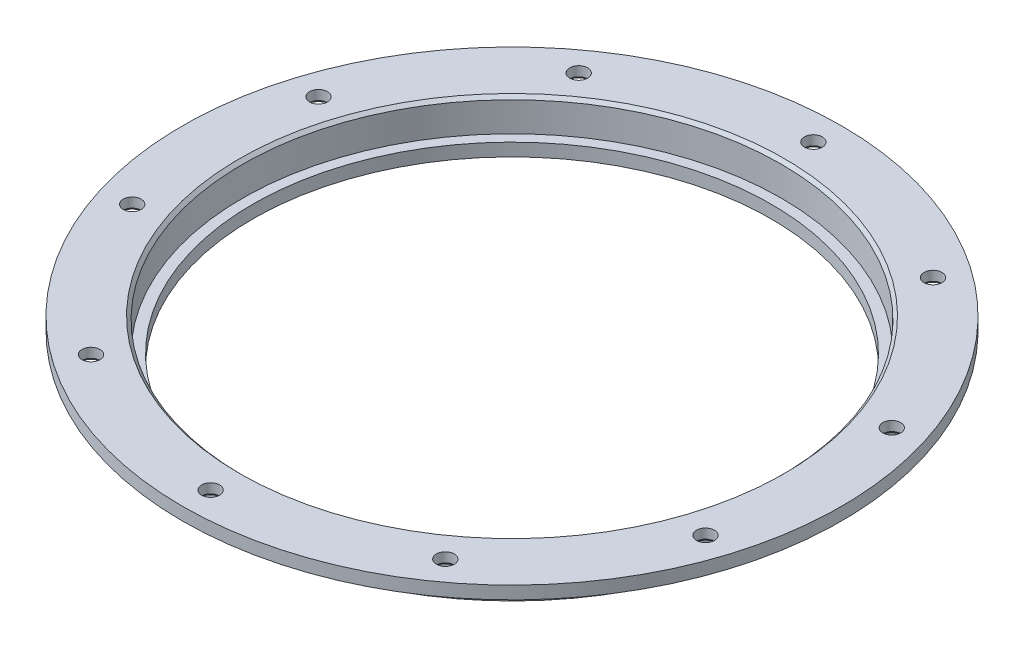
ISO-10303-21;
HEADER;
FILE_DESCRIPTION(('STEP AP214'),'2;1');
FILE_NAME('part.step','',(''),(''),'','','');
FILE_SCHEMA(('AUTOMOTIVE_DESIGN { 1 0 10303 214 1 1 1 1 }'));
ENDSEC;
DATA;
#1=APPLICATION_CONTEXT('core data for automotive mechanical design processes');
#2=APPLICATION_PROTOCOL_DEFINITION('international standard','automotive_design',2000,#1);
#3=PRODUCT_CONTEXT('',#1,'mechanical');
#4=PRODUCT('Part','Part','',(#3));
#5=PRODUCT_RELATED_PRODUCT_CATEGORY('part','',(#4));
#6=PRODUCT_DEFINITION_FORMATION('','',#4);
#7=PRODUCT_DEFINITION_CONTEXT('part definition',#1,'design');
#8=PRODUCT_DEFINITION('design','',#6,#7);
#9=PRODUCT_DEFINITION_SHAPE('','',#8);
#10=(LENGTH_UNIT() NAMED_UNIT(*) SI_UNIT(.MILLI.,.METRE.));
#11=(NAMED_UNIT(*) PLANE_ANGLE_UNIT() SI_UNIT($,.RADIAN.));
#12=(NAMED_UNIT(*) SI_UNIT($,.STERADIAN.) SOLID_ANGLE_UNIT());
#13=UNCERTAINTY_MEASURE_WITH_UNIT(LENGTH_MEASURE(1.E-05),#10,'distance_accuracy_value','');
#14=(GEOMETRIC_REPRESENTATION_CONTEXT(3) GLOBAL_UNCERTAINTY_ASSIGNED_CONTEXT((#13)) GLOBAL_UNIT_ASSIGNED_CONTEXT((#10,
#11,#12)) REPRESENTATION_CONTEXT('',''));
#15=CARTESIAN_POINT('',(0.,0.,0.));
#16=DIRECTION('',(0.,0.,1.));
#17=DIRECTION('',(1.,0.,0.));
#18=AXIS2_PLACEMENT_3D('',#15,#16,#17);
#19=CARTESIAN_POINT('',(0.,2.,0.));
#20=DIRECTION('',(0.,1.,0.));
#21=DIRECTION('',(0.,0.,1.));
#22=AXIS2_PLACEMENT_3D('',#19,#20,#21);
#23=PLANE('',#22);
#24=CARTESIAN_POINT('',(0.,2.,0.));
#25=DIRECTION('',(0.,1.,0.));
#26=DIRECTION('',(0.,0.,1.));
#27=AXIS2_PLACEMENT_3D('',#24,#25,#26);
#28=CIRCLE('',#27,40.5);
#29=CARTESIAN_POINT('',(0.,2.,40.5));
#30=VERTEX_POINT('',#29);
#31=EDGE_CURVE('E153',#30,#30,#28,.T.);
#32=ORIENTED_EDGE('',*,*,#31,.F.);
#33=EDGE_LOOP('',(#32));
#34=FACE_BOUND('',#33,.T.);
#35=CARTESIAN_POINT('',(0.,2.,0.));
#36=DIRECTION('',(0.,1.,0.));
#37=DIRECTION('',(0.,0.,1.));
#38=AXIS2_PLACEMENT_3D('',#35,#36,#37);
#39=CIRCLE('',#38,42.1);
#40=CARTESIAN_POINT('',(0.,2.,-42.1));
#41=VERTEX_POINT('',#40);
#42=EDGE_CURVE('E158',#41,#41,#39,.T.);
#43=ORIENTED_EDGE('',*,*,#42,.T.);
#44=EDGE_LOOP('',(#43));
#45=FACE_BOUND('',#44,.T.);
#46=ADVANCED_FACE('F44',(#34,#45),#23,.T.);
#47=CARTESIAN_POINT('',(0.,0.,0.));
#48=DIRECTION('',(0.,1.,0.));
#49=DIRECTION('',(0.,0.,1.));
#50=AXIS2_PLACEMENT_3D('',#47,#48,#49);
#51=PLANE('',#50);
#52=CARTESIAN_POINT('',(0.,0.,0.));
#53=DIRECTION('',(0.,1.,0.));
#54=DIRECTION('',(0.,0.,1.));
#55=AXIS2_PLACEMENT_3D('',#52,#53,#54);
#56=CIRCLE('',#55,44.5);
#57=CARTESIAN_POINT('',(0.,0.,44.5));
#58=VERTEX_POINT('',#57);
#59=EDGE_CURVE('E149',#58,#58,#56,.T.);
#60=ORIENTED_EDGE('',*,*,#59,.F.);
#61=EDGE_LOOP('',(#60));
#62=FACE_BOUND('',#61,.T.);
#63=CARTESIAN_POINT('',(0.,0.,0.));
#64=DIRECTION('',(0.,1.,0.));
#65=DIRECTION('',(0.,0.,1.));
#66=AXIS2_PLACEMENT_3D('',#63,#64,#65);
#67=CIRCLE('',#66,40.5);
#68=CARTESIAN_POINT('',(0.,0.,40.5));
#69=VERTEX_POINT('',#68);
#70=EDGE_CURVE('E154',#69,#69,#67,.T.);
#71=ORIENTED_EDGE('',*,*,#70,.T.);
#72=EDGE_LOOP('',(#71));
#73=FACE_BOUND('',#72,.T.);
#74=ADVANCED_FACE('F257',(#62,#73),#51,.F.);
#75=CARTESIAN_POINT('',(0.,2.,0.));
#76=DIRECTION('',(0.,-1.,0.));
#77=DIRECTION('',(0.,0.,-1.));
#78=AXIS2_PLACEMENT_3D('',#75,#76,#77);
#79=CYLINDRICAL_SURFACE('',#78,44.5);
#80=CARTESIAN_POINT('',(0.,4.59999999999999,0.));
#81=DIRECTION('',(0.,1.,0.));
#82=DIRECTION('',(0.,0.,1.));
#83=AXIS2_PLACEMENT_3D('',#80,#81,#82);
#84=CIRCLE('',#83,44.5);
#85=CARTESIAN_POINT('',(0.,4.59999999999999,44.5));
#86=VERTEX_POINT('',#85);
#87=EDGE_CURVE('E58',#86,#86,#84,.F.);
#88=ORIENTED_EDGE('',*,*,#87,.T.);
#89=EDGE_LOOP('',(#88));
#90=FACE_BOUND('',#89,.T.);
#91=ORIENTED_EDGE('',*,*,#59,.T.);
#92=EDGE_LOOP('',(#91));
#93=FACE_BOUND('',#92,.T.);
#94=ADVANCED_FACE('F264',(#90,#93),#79,.T.);
#95=CARTESIAN_POINT('',(0.,2.,0.));
#96=DIRECTION('',(0.,-1.,0.));
#97=DIRECTION('',(0.,0.,-1.));
#98=AXIS2_PLACEMENT_3D('',#95,#96,#97);
#99=CYLINDRICAL_SURFACE('',#98,40.5);
#100=ORIENTED_EDGE('',*,*,#31,.T.);
#101=EDGE_LOOP('',(#100));
#102=FACE_BOUND('',#101,.T.);
#103=ORIENTED_EDGE('',*,*,#70,.F.);
#104=EDGE_LOOP('',(#103));
#105=FACE_BOUND('',#104,.T.);
#106=ADVANCED_FACE('F270',(#102,#105),#99,.F.);
#107=CARTESIAN_POINT('',(0.,5.1,0.));
#108=DIRECTION('',(0.,-1.,0.));
#109=DIRECTION('',(0.,0.,-1.));
#110=AXIS2_PLACEMENT_3D('',#107,#108,#109);
#111=CYLINDRICAL_SURFACE('',#110,42.1);
#112=CARTESIAN_POINT('',(0.,6.59999999999996,0.));
#113=DIRECTION('',(0.,1.,0.));
#114=DIRECTION('',(0.,0.,1.));
#115=AXIS2_PLACEMENT_3D('',#112,#113,#114);
#116=CIRCLE('',#115,42.1);
#117=CARTESIAN_POINT('',(0.,6.59999999999996,-42.1));
#118=VERTEX_POINT('',#117);
#119=EDGE_CURVE('E53',#118,#118,#116,.T.);
#120=CARTESIAN_POINT('',(0.,6.59999999999996,-42.1));
#121=CARTESIAN_POINT('',(0.,6.55208333333329,-42.1));
#122=CARTESIAN_POINT('',(0.,6.50416666666663,-42.1));
#123=CARTESIAN_POINT('',(0.,6.40833333333329,-42.1));
#124=CARTESIAN_POINT('',(0.,6.36041666666663,-42.1));
#125=CARTESIAN_POINT('',(0.,6.26458333333329,-42.1));
#126=CARTESIAN_POINT('',(0.,6.21666666666663,-42.1));
#127=CARTESIAN_POINT('',(0.,6.1208333333333,-42.1));
#128=CARTESIAN_POINT('',(0.,6.07291666666663,-42.1));
#129=CARTESIAN_POINT('',(0.,5.9770833333333,-42.1));
#130=CARTESIAN_POINT('',(0.,5.92916666666663,-42.1));
#131=CARTESIAN_POINT('',(0.,5.8333333333333,-42.1));
#132=CARTESIAN_POINT('',(0.,5.78541666666663,-42.1));
#133=CARTESIAN_POINT('',(0.,5.6895833333333,-42.1));
#134=CARTESIAN_POINT('',(0.,5.64166666666663,-42.1));
#135=CARTESIAN_POINT('',(0.,5.5458333333333,-42.1));
#136=CARTESIAN_POINT('',(0.,5.49791666666663,-42.1));
#137=CARTESIAN_POINT('',(0.,5.4020833333333,-42.1));
#138=CARTESIAN_POINT('',(0.,5.35416666666664,-42.1));
#139=CARTESIAN_POINT('',(0.,5.2583333333333,-42.1));
#140=CARTESIAN_POINT('',(0.,5.21041666666664,-42.1));
#141=CARTESIAN_POINT('',(0.,5.1145833333333,-42.1));
#142=CARTESIAN_POINT('',(0.,5.06666666666664,-42.1));
#143=CARTESIAN_POINT('',(0.,4.97083333333331,-42.1));
#144=CARTESIAN_POINT('',(0.,4.92291666666664,-42.1));
#145=CARTESIAN_POINT('',(0.,4.82708333333331,-42.1));
#146=CARTESIAN_POINT('',(0.,4.77916666666664,-42.1));
#147=CARTESIAN_POINT('',(0.,4.68333333333331,-42.1));
#148=CARTESIAN_POINT('',(0.,4.63541666666664,-42.1));
#149=CARTESIAN_POINT('',(0.,4.53958333333331,-42.1));
#150=CARTESIAN_POINT('',(0.,4.49166666666664,-42.1));
#151=CARTESIAN_POINT('',(0.,4.39583333333331,-42.1));
#152=CARTESIAN_POINT('',(0.,4.34791666666665,-42.1));
#153=CARTESIAN_POINT('',(0.,4.25208333333331,-42.1));
#154=CARTESIAN_POINT('',(0.,4.20416666666665,-42.1));
#155=CARTESIAN_POINT('',(0.,4.10833333333331,-42.1));
#156=CARTESIAN_POINT('',(0.,4.06041666666665,-42.1));
#157=CARTESIAN_POINT('',(0.,3.96458333333332,-42.1));
#158=CARTESIAN_POINT('',(0.,3.91666666666665,-42.1));
#159=CARTESIAN_POINT('',(0.,3.82083333333332,-42.1));
#160=CARTESIAN_POINT('',(0.,3.77291666666665,-42.1));
#161=CARTESIAN_POINT('',(0.,3.67708333333332,-42.1));
#162=CARTESIAN_POINT('',(0.,3.62916666666665,-42.1));
#163=CARTESIAN_POINT('',(0.,3.53333333333332,-42.1));
#164=CARTESIAN_POINT('',(0.,3.48541666666665,-42.1));
#165=CARTESIAN_POINT('',(0.,3.38958333333332,-42.1));
#166=CARTESIAN_POINT('',(0.,3.34166666666665,-42.1));
#167=CARTESIAN_POINT('',(0.,3.24583333333332,-42.1));
#168=CARTESIAN_POINT('',(0.,3.19791666666666,-42.1));
#169=CARTESIAN_POINT('',(0.,3.10208333333332,-42.1));
#170=CARTESIAN_POINT('',(0.,3.05416666666666,-42.1));
#171=CARTESIAN_POINT('',(0.,2.95833333333332,-42.1));
#172=CARTESIAN_POINT('',(0.,2.91041666666666,-42.1));
#173=CARTESIAN_POINT('',(0.,2.81458333333333,-42.1));
#174=CARTESIAN_POINT('',(0.,2.76666666666666,-42.1));
#175=CARTESIAN_POINT('',(0.,2.67083333333333,-42.1));
#176=CARTESIAN_POINT('',(0.,2.62291666666666,-42.1));
#177=CARTESIAN_POINT('',(0.,2.52708333333333,-42.1));
#178=CARTESIAN_POINT('',(0.,2.47916666666666,-42.1));
#179=CARTESIAN_POINT('',(0.,2.38333333333333,-42.1));
#180=CARTESIAN_POINT('',(0.,2.33541666666666,-42.1));
#181=CARTESIAN_POINT('',(0.,2.23958333333333,-42.1));
#182=CARTESIAN_POINT('',(0.,2.19166666666667,-42.1));
#183=CARTESIAN_POINT('',(0.,2.09583333333333,-42.1));
#184=CARTESIAN_POINT('',(0.,2.04791666666667,-42.1));
#185=CARTESIAN_POINT('',(0.,2.,-42.1));
#186=B_SPLINE_CURVE_WITH_KNOTS('',3,(#120,#121,#122,#123,#124,#125,#126,#127,#128,#129,#130,
#131,#132,#133,#134,#135,#136,#137,#138,#139,#140,#141,#142,#143,#144,#145,#146,#147,#148,#149,
#150,#151,#152,#153,#154,#155,#156,#157,#158,#159,#160,#161,#162,#163,#164,#165,#166,#167,#168,
#169,#170,#171,#172,#173,#174,#175,#176,#177,#178,#179,#180,#181,#182,#183,#184,#185),
.UNSPECIFIED.,.F.,.F.,(4,2,2,2,2,2,2,2,2,2,2,2,2,2,2,2,2,2,2,2,2,2,2,2,2,2,2,2,2,2,2,2,4),(0.,
0.143749999999999,0.287499999999997,0.431249999999996,0.574999999999995,0.718749999999993,
0.862499999999992,1.00624999999999,1.14999999999999,1.29374999999999,1.43749999999999,
1.58124999999999,1.72499999999998,1.86874999999998,2.01249999999998,2.15624999999998,
2.29999999999998,2.44374999999998,2.58749999999998,2.73124999999997,2.87499999999997,
3.01874999999997,3.16249999999997,3.30624999999997,3.44999999999997,3.59374999999997,
3.73749999999997,3.88124999999996,4.02499999999996,4.16874999999996,4.31249999999996,
4.45624999999996,4.59999999999996),.UNSPECIFIED.);
#187=EDGE_CURVE('BSEAM220',#118,#41,#186,.T.);
#188=ORIENTED_EDGE('',*,*,#119,.T.);
#189=ORIENTED_EDGE('',*,*,#42,.F.);
#190=ORIENTED_EDGE('',*,*,#187,.T.);
#191=ORIENTED_EDGE('',*,*,#187,.F.);
#192=EDGE_LOOP('',(#188,#190,#189,#191));
#193=FACE_BOUND('',#192,.T.);
#194=ADVANCED_FACE('F220',(#193),#111,.F.);
#195=CARTESIAN_POINT('',(0.,7.1,0.));
#196=DIRECTION('',(0.,1.,0.));
#197=DIRECTION('',(0.,0.,1.));
#198=AXIS2_PLACEMENT_3D('',#195,#196,#197);
#199=PLANE('',#198);
#200=CARTESIAN_POINT('',(0.,7.1,0.));
#201=DIRECTION('',(0.,1.,0.));
#202=DIRECTION('',(0.,0.,1.));
#203=AXIS2_PLACEMENT_3D('',#200,#201,#202);
#204=CIRCLE('',#203,42.6);
#205=CARTESIAN_POINT('',(0.,7.1,42.6));
#206=VERTEX_POINT('',#205);
#207=EDGE_CURVE('E10',#206,#206,#204,.F.);
#208=ORIENTED_EDGE('',*,*,#207,.T.);
#209=EDGE_LOOP('',(#208));
#210=FACE_BOUND('',#209,.T.);
#211=CARTESIAN_POINT('',(0.,7.1,-47.1));
#212=DIRECTION('',(0.,1.,0.));
#213=DIRECTION('',(0.,0.,1.));
#214=AXIS2_PLACEMENT_3D('',#211,#212,#213);
#215=CIRCLE('',#214,1.4);
#216=CARTESIAN_POINT('',(0.,7.1,-45.7));
#217=VERTEX_POINT('',#216);
#218=EDGE_CURVE('E170',#217,#217,#215,.T.);
#219=ORIENTED_EDGE('',*,*,#218,.F.);
#220=EDGE_LOOP('',(#219));
#221=FACE_BOUND('',#220,.T.);
#222=CARTESIAN_POINT('',(-27.6846853829755,7.1,-38.10470043506));
#223=DIRECTION('',(0.,1.,0.));
#224=DIRECTION('',(0.,0.,1.));
#225=AXIS2_PLACEMENT_3D('',#222,#223,#224);
#226=CIRCLE('',#225,1.4);
#227=CARTESIAN_POINT('',(-27.6846853829755,7.1,-36.70470043506));
#228=VERTEX_POINT('',#227);
#229=EDGE_CURVE('E179',#228,#228,#226,.T.);
#230=ORIENTED_EDGE('',*,*,#229,.F.);
#231=EDGE_LOOP('',(#230));
#232=FACE_BOUND('',#231,.T.);
#233=CARTESIAN_POINT('',(-44.7947619175017,7.1,-14.55470043506));
#234=DIRECTION('',(0.,1.,0.));
#235=DIRECTION('',(0.,0.,1.));
#236=AXIS2_PLACEMENT_3D('',#233,#234,#235);
#237=CIRCLE('',#236,1.4);
#238=CARTESIAN_POINT('',(-44.7947619175017,7.1,-13.15470043506));
#239=VERTEX_POINT('',#238);
#240=EDGE_CURVE('E174',#239,#239,#237,.T.);
#241=ORIENTED_EDGE('',*,*,#240,.F.);
#242=EDGE_LOOP('',(#241));
#243=FACE_BOUND('',#242,.T.);
#244=CARTESIAN_POINT('',(-44.7947619175017,7.1,14.55470043506));
#245=DIRECTION('',(0.,1.,0.));
#246=DIRECTION('',(0.,0.,1.));
#247=AXIS2_PLACEMENT_3D('',#244,#245,#246);
#248=CIRCLE('',#247,1.4);
#249=CARTESIAN_POINT('',(-44.7947619175017,7.1,15.95470043506));
#250=VERTEX_POINT('',#249);
#251=EDGE_CURVE('E178',#250,#250,#248,.T.);
#252=ORIENTED_EDGE('',*,*,#251,.F.);
#253=EDGE_LOOP('',(#252));
#254=FACE_BOUND('',#253,.T.);
#255=CARTESIAN_POINT('',(-27.6846853829755,7.1,38.10470043506));
#256=DIRECTION('',(0.,1.,0.));
#257=DIRECTION('',(0.,0.,1.));
#258=AXIS2_PLACEMENT_3D('',#255,#256,#257);
#259=CIRCLE('',#258,1.4);
#260=CARTESIAN_POINT('',(-27.6846853829755,7.1,39.50470043506));
#261=VERTEX_POINT('',#260);
#262=EDGE_CURVE('E183',#261,#261,#259,.T.);
#263=ORIENTED_EDGE('',*,*,#262,.F.);
#264=EDGE_LOOP('',(#263));
#265=FACE_BOUND('',#264,.T.);
#266=CARTESIAN_POINT('',(0.,7.1,47.1));
#267=DIRECTION('',(0.,1.,0.));
#268=DIRECTION('',(0.,0.,1.));
#269=AXIS2_PLACEMENT_3D('',#266,#267,#268);
#270=CIRCLE('',#269,1.4);
#271=CARTESIAN_POINT('',(0.,7.1,48.5));
#272=VERTEX_POINT('',#271);
#273=EDGE_CURVE('E187',#272,#272,#270,.T.);
#274=ORIENTED_EDGE('',*,*,#273,.F.);
#275=EDGE_LOOP('',(#274));
#276=FACE_BOUND('',#275,.T.);
#277=CARTESIAN_POINT('',(27.6846853829755,7.1,38.10470043506));
#278=DIRECTION('',(0.,1.,0.));
#279=DIRECTION('',(0.,0.,1.));
#280=AXIS2_PLACEMENT_3D('',#277,#278,#279);
#281=CIRCLE('',#280,1.4);
#282=CARTESIAN_POINT('',(27.6846853829755,7.1,39.50470043506));
#283=VERTEX_POINT('',#282);
#284=EDGE_CURVE('E191',#283,#283,#281,.T.);
#285=ORIENTED_EDGE('',*,*,#284,.F.);
#286=EDGE_LOOP('',(#285));
#287=FACE_BOUND('',#286,.T.);
#288=CARTESIAN_POINT('',(44.7947619175017,7.1,14.55470043506));
#289=DIRECTION('',(0.,1.,0.));
#290=DIRECTION('',(0.,0.,1.));
#291=AXIS2_PLACEMENT_3D('',#288,#289,#290);
#292=CIRCLE('',#291,1.4);
#293=CARTESIAN_POINT('',(44.7947619175017,7.1,15.95470043506));
#294=VERTEX_POINT('',#293);
#295=EDGE_CURVE('E195',#294,#294,#292,.T.);
#296=ORIENTED_EDGE('',*,*,#295,.F.);
#297=EDGE_LOOP('',(#296));
#298=FACE_BOUND('',#297,.T.);
#299=CARTESIAN_POINT('',(44.7947619175017,7.1,-14.55470043506));
#300=DIRECTION('',(0.,1.,0.));
#301=DIRECTION('',(0.,0.,1.));
#302=AXIS2_PLACEMENT_3D('',#299,#300,#301);
#303=CIRCLE('',#302,1.4);
#304=CARTESIAN_POINT('',(44.7947619175017,7.1,-13.15470043506));
#305=VERTEX_POINT('',#304);
#306=EDGE_CURVE('E199',#305,#305,#303,.T.);
#307=ORIENTED_EDGE('',*,*,#306,.F.);
#308=EDGE_LOOP('',(#307));
#309=FACE_BOUND('',#308,.T.);
#310=CARTESIAN_POINT('',(27.6846853829755,7.1,-38.10470043506));
#311=DIRECTION('',(0.,1.,0.));
#312=DIRECTION('',(0.,0.,1.));
#313=AXIS2_PLACEMENT_3D('',#310,#311,#312);
#314=CIRCLE('',#313,1.4);
#315=CARTESIAN_POINT('',(27.6846853829755,7.1,-36.70470043506));
#316=VERTEX_POINT('',#315);
#317=EDGE_CURVE('E203',#316,#316,#314,.T.);
#318=ORIENTED_EDGE('',*,*,#317,.F.);
#319=EDGE_LOOP('',(#318));
#320=FACE_BOUND('',#319,.T.);
#321=CARTESIAN_POINT('',(0.,7.1,0.));
#322=DIRECTION('',(0.,1.,0.));
#323=DIRECTION('',(0.,0.,1.));
#324=AXIS2_PLACEMENT_3D('',#321,#322,#323);
#325=CIRCLE('',#324,51.5);
#326=CARTESIAN_POINT('',(0.,7.1,51.5));
#327=VERTEX_POINT('',#326);
#328=EDGE_CURVE('E165',#327,#327,#325,.T.);
#329=ORIENTED_EDGE('',*,*,#328,.T.);
#330=EDGE_LOOP('',(#329));
#331=FACE_BOUND('',#330,.T.);
#332=ADVANCED_FACE('F216',(#210,#221,#232,#243,#254,#265,#276,#287,#298,#309,#320,#331),#199,.T.);
#333=CARTESIAN_POINT('',(0.,5.1,0.));
#334=DIRECTION('',(0.,1.,0.));
#335=DIRECTION('',(0.,0.,1.));
#336=AXIS2_PLACEMENT_3D('',#333,#334,#335);
#337=PLANE('',#336);
#338=CARTESIAN_POINT('',(0.,5.1,0.));
#339=DIRECTION('',(0.,1.,0.));
#340=DIRECTION('',(0.,0.,1.));
#341=AXIS2_PLACEMENT_3D('',#338,#339,#340);
#342=CIRCLE('',#341,45.);
#343=CARTESIAN_POINT('',(0.,5.1,45.));
#344=VERTEX_POINT('',#343);
#345=EDGE_CURVE('E63',#344,#344,#342,.T.);
#346=ORIENTED_EDGE('',*,*,#345,.T.);
#347=EDGE_LOOP('',(#346));
#348=FACE_BOUND('',#347,.T.);
#349=CARTESIAN_POINT('',(-44.7947619175017,5.1,14.55470043506));
#350=DIRECTION('',(0.,1.,0.));
#351=DIRECTION('',(0.,0.,1.));
#352=AXIS2_PLACEMENT_3D('',#349,#350,#351);
#353=CIRCLE('',#352,1.90000000000003);
#354=CARTESIAN_POINT('',(-44.7947619175017,5.1,16.4547004350601));
#355=VERTEX_POINT('',#354);
#356=EDGE_CURVE('E109',#355,#355,#353,.T.);
#357=ORIENTED_EDGE('',*,*,#356,.T.);
#358=EDGE_LOOP('',(#357));
#359=FACE_BOUND('',#358,.T.);
#360=CARTESIAN_POINT('',(-44.7947619175017,5.1,-14.55470043506));
#361=DIRECTION('',(0.,1.,0.));
#362=DIRECTION('',(0.,0.,1.));
#363=AXIS2_PLACEMENT_3D('',#360,#361,#362);
#364=CIRCLE('',#363,1.89999999999999);
#365=CARTESIAN_POINT('',(-44.7947619175017,5.1,-12.65470043506));
#366=VERTEX_POINT('',#365);
#367=EDGE_CURVE('E113',#366,#366,#364,.T.);
#368=ORIENTED_EDGE('',*,*,#367,.T.);
#369=EDGE_LOOP('',(#368));
#370=FACE_BOUND('',#369,.T.);
#371=CARTESIAN_POINT('',(-27.6846853829755,5.1,-38.10470043506));
#372=DIRECTION('',(0.,1.,0.));
#373=DIRECTION('',(0.,0.,1.));
#374=AXIS2_PLACEMENT_3D('',#371,#372,#373);
#375=CIRCLE('',#374,1.89999999999999);
#376=CARTESIAN_POINT('',(-27.6846853829755,5.1,-36.20470043506));
#377=VERTEX_POINT('',#376);
#378=EDGE_CURVE('E117',#377,#377,#375,.T.);
#379=ORIENTED_EDGE('',*,*,#378,.T.);
#380=EDGE_LOOP('',(#379));
#381=FACE_BOUND('',#380,.T.);
#382=CARTESIAN_POINT('',(0.,5.1,-47.1));
#383=DIRECTION('',(0.,1.,0.));
#384=DIRECTION('',(0.,0.,1.));
#385=AXIS2_PLACEMENT_3D('',#382,#383,#384);
#386=CIRCLE('',#385,1.90000000000003);
#387=CARTESIAN_POINT('',(0.,5.1,-45.2));
#388=VERTEX_POINT('',#387);
#389=EDGE_CURVE('E121',#388,#388,#386,.T.);
#390=ORIENTED_EDGE('',*,*,#389,.T.);
#391=EDGE_LOOP('',(#390));
#392=FACE_BOUND('',#391,.T.);
#393=CARTESIAN_POINT('',(-27.6846853829755,5.1,38.10470043506));
#394=DIRECTION('',(0.,1.,0.));
#395=DIRECTION('',(0.,0.,1.));
#396=AXIS2_PLACEMENT_3D('',#393,#394,#395);
#397=CIRCLE('',#396,1.90000000000003);
#398=CARTESIAN_POINT('',(-27.6846853829755,5.1,40.00470043506));
#399=VERTEX_POINT('',#398);
#400=EDGE_CURVE('E125',#399,#399,#397,.T.);
#401=ORIENTED_EDGE('',*,*,#400,.T.);
#402=EDGE_LOOP('',(#401));
#403=FACE_BOUND('',#402,.T.);
#404=CARTESIAN_POINT('',(27.6846853829755,5.1,38.10470043506));
#405=DIRECTION('',(0.,1.,0.));
#406=DIRECTION('',(0.,0.,1.));
#407=AXIS2_PLACEMENT_3D('',#404,#405,#406);
#408=CIRCLE('',#407,1.90000000000003);
#409=CARTESIAN_POINT('',(27.6846853829755,5.1,40.0047004350601));
#410=VERTEX_POINT('',#409);
#411=EDGE_CURVE('E129',#410,#410,#408,.T.);
#412=ORIENTED_EDGE('',*,*,#411,.T.);
#413=EDGE_LOOP('',(#412));
#414=FACE_BOUND('',#413,.T.);
#415=CARTESIAN_POINT('',(0.,5.1,47.1));
#416=DIRECTION('',(0.,1.,0.));
#417=DIRECTION('',(0.,0.,1.));
#418=AXIS2_PLACEMENT_3D('',#415,#416,#417);
#419=CIRCLE('',#418,1.89999999999999);
#420=CARTESIAN_POINT('',(0.,5.1,49.));
#421=VERTEX_POINT('',#420);
#422=EDGE_CURVE('E133',#421,#421,#419,.T.);
#423=ORIENTED_EDGE('',*,*,#422,.T.);
#424=EDGE_LOOP('',(#423));
#425=FACE_BOUND('',#424,.T.);
#426=CARTESIAN_POINT('',(27.6846853829755,5.1,-38.10470043506));
#427=DIRECTION('',(0.,1.,0.));
#428=DIRECTION('',(0.,0.,1.));
#429=AXIS2_PLACEMENT_3D('',#426,#427,#428);
#430=CIRCLE('',#429,1.89999999999999);
#431=CARTESIAN_POINT('',(27.6846853829755,5.1,-36.20470043506));
#432=VERTEX_POINT('',#431);
#433=EDGE_CURVE('E137',#432,#432,#430,.T.);
#434=ORIENTED_EDGE('',*,*,#433,.T.);
#435=EDGE_LOOP('',(#434));
#436=FACE_BOUND('',#435,.T.);
#437=CARTESIAN_POINT('',(44.7947619175017,5.1,14.55470043506));
#438=DIRECTION('',(0.,1.,0.));
#439=DIRECTION('',(0.,0.,1.));
#440=AXIS2_PLACEMENT_3D('',#437,#438,#439);
#441=CIRCLE('',#440,1.90000000000003);
#442=CARTESIAN_POINT('',(44.7947619175017,5.1,16.4547004350601));
#443=VERTEX_POINT('',#442);
#444=EDGE_CURVE('E141',#443,#443,#441,.T.);
#445=ORIENTED_EDGE('',*,*,#444,.T.);
#446=EDGE_LOOP('',(#445));
#447=FACE_BOUND('',#446,.T.);
#448=CARTESIAN_POINT('',(44.7947619175017,5.1,-14.55470043506));
#449=DIRECTION('',(0.,1.,0.));
#450=DIRECTION('',(0.,0.,1.));
#451=AXIS2_PLACEMENT_3D('',#448,#449,#450);
#452=CIRCLE('',#451,1.89999999999999);
#453=CARTESIAN_POINT('',(44.7947619175017,5.1,-12.65470043506));
#454=VERTEX_POINT('',#453);
#455=EDGE_CURVE('E145',#454,#454,#452,.T.);
#456=ORIENTED_EDGE('',*,*,#455,.T.);
#457=EDGE_LOOP('',(#456));
#458=FACE_BOUND('',#457,.T.);
#459=CARTESIAN_POINT('',(0.,5.1,0.));
#460=DIRECTION('',(0.,1.,0.));
#461=DIRECTION('',(0.,0.,1.));
#462=AXIS2_PLACEMENT_3D('',#459,#460,#461);
#463=CIRCLE('',#462,51.5);
#464=CARTESIAN_POINT('',(0.,5.1,51.5));
#465=VERTEX_POINT('',#464);
#466=EDGE_CURVE('E166',#465,#465,#463,.T.);
#467=ORIENTED_EDGE('',*,*,#466,.F.);
#468=EDGE_LOOP('',(#467));
#469=FACE_BOUND('',#468,.T.);
#470=ADVANCED_FACE('F219',(#348,#359,#370,#381,#392,#403,#414,#425,#436,#447,#458,#469),#337,.F.);
#471=CARTESIAN_POINT('',(0.,7.1,0.));
#472=DIRECTION('',(0.,-1.,0.));
#473=DIRECTION('',(0.,0.,-1.));
#474=AXIS2_PLACEMENT_3D('',#471,#472,#473);
#475=CYLINDRICAL_SURFACE('',#474,51.5);
#476=ORIENTED_EDGE('',*,*,#328,.F.);
#477=EDGE_LOOP('',(#476));
#478=FACE_BOUND('',#477,.T.);
#479=ORIENTED_EDGE('',*,*,#466,.T.);
#480=EDGE_LOOP('',(#479));
#481=FACE_BOUND('',#480,.T.);
#482=ADVANCED_FACE('F242',(#478,#481),#475,.T.);
#483=CARTESIAN_POINT('',(27.6846853829755,0.,-38.10470043506));
#484=DIRECTION('',(0.,1.,0.));
#485=DIRECTION('',(0.,0.,1.));
#486=AXIS2_PLACEMENT_3D('',#483,#484,#485);
#487=CYLINDRICAL_SURFACE('',#486,1.4);
#488=CARTESIAN_POINT('',(27.6846853829755,5.59999999999999,-38.10470043506));
#489=DIRECTION('',(0.,1.,0.));
#490=DIRECTION('',(0.,0.,1.));
#491=AXIS2_PLACEMENT_3D('',#488,#489,#490);
#492=CIRCLE('',#491,1.4);
#493=CARTESIAN_POINT('',(27.6846853829755,5.59999999999999,-36.70470043506));
#494=VERTEX_POINT('',#493);
#495=EDGE_CURVE('E77',#494,#494,#492,.F.);
#496=ORIENTED_EDGE('',*,*,#495,.T.);
#497=EDGE_LOOP('',(#496));
#498=FACE_BOUND('',#497,.T.);
#499=ORIENTED_EDGE('',*,*,#317,.T.);
#500=EDGE_LOOP('',(#499));
#501=FACE_BOUND('',#500,.T.);
#502=ADVANCED_FACE('F245',(#498,#501),#487,.F.);
#503=CARTESIAN_POINT('',(44.7947619175017,0.,-14.55470043506));
#504=DIRECTION('',(0.,1.,0.));
#505=DIRECTION('',(0.,0.,1.));
#506=AXIS2_PLACEMENT_3D('',#503,#504,#505);
#507=CYLINDRICAL_SURFACE('',#506,1.4);
#508=CARTESIAN_POINT('',(44.7947619175017,5.59999999999999,-14.55470043506));
#509=DIRECTION('',(0.,1.,0.));
#510=DIRECTION('',(0.,0.,1.));
#511=AXIS2_PLACEMENT_3D('',#508,#509,#510);
#512=CIRCLE('',#511,1.4);
#513=CARTESIAN_POINT('',(44.7947619175017,5.59999999999999,-13.15470043506));
#514=VERTEX_POINT('',#513);
#515=EDGE_CURVE('E69',#514,#514,#512,.F.);
#516=ORIENTED_EDGE('',*,*,#515,.T.);
#517=EDGE_LOOP('',(#516));
#518=FACE_BOUND('',#517,.T.);
#519=ORIENTED_EDGE('',*,*,#306,.T.);
#520=EDGE_LOOP('',(#519));
#521=FACE_BOUND('',#520,.T.);
#522=ADVANCED_FACE('F398',(#518,#521),#507,.F.);
#523=CARTESIAN_POINT('',(44.7947619175017,0.,14.55470043506));
#524=DIRECTION('',(0.,1.,0.));
#525=DIRECTION('',(0.,0.,1.));
#526=AXIS2_PLACEMENT_3D('',#523,#524,#525);
#527=CYLINDRICAL_SURFACE('',#526,1.4);
#528=CARTESIAN_POINT('',(44.7947619175017,5.60000000000003,14.55470043506));
#529=DIRECTION('',(0.,1.,0.));
#530=DIRECTION('',(0.,0.,1.));
#531=AXIS2_PLACEMENT_3D('',#528,#529,#530);
#532=CIRCLE('',#531,1.4);
#533=CARTESIAN_POINT('',(44.7947619175017,5.60000000000003,15.95470043506));
#534=VERTEX_POINT('',#533);
#535=EDGE_CURVE('E73',#534,#534,#532,.F.);
#536=ORIENTED_EDGE('',*,*,#535,.T.);
#537=EDGE_LOOP('',(#536));
#538=FACE_BOUND('',#537,.T.);
#539=ORIENTED_EDGE('',*,*,#295,.T.);
#540=EDGE_LOOP('',(#539));
#541=FACE_BOUND('',#540,.T.);
#542=ADVANCED_FACE('F408',(#538,#541),#527,.F.);
#543=CARTESIAN_POINT('',(27.6846853829755,0.,38.10470043506));
#544=DIRECTION('',(0.,1.,0.));
#545=DIRECTION('',(0.,0.,1.));
#546=AXIS2_PLACEMENT_3D('',#543,#544,#545);
#547=CYLINDRICAL_SURFACE('',#546,1.4);
#548=CARTESIAN_POINT('',(27.6846853829755,5.60000000000003,38.10470043506));
#549=DIRECTION('',(0.,1.,0.));
#550=DIRECTION('',(0.,0.,1.));
#551=AXIS2_PLACEMENT_3D('',#548,#549,#550);
#552=CIRCLE('',#551,1.4);
#553=CARTESIAN_POINT('',(27.6846853829755,5.60000000000003,39.50470043506));
#554=VERTEX_POINT('',#553);
#555=EDGE_CURVE('E85',#554,#554,#552,.F.);
#556=ORIENTED_EDGE('',*,*,#555,.T.);
#557=EDGE_LOOP('',(#556));
#558=FACE_BOUND('',#557,.T.);
#559=ORIENTED_EDGE('',*,*,#284,.T.);
#560=EDGE_LOOP('',(#559));
#561=FACE_BOUND('',#560,.T.);
#562=ADVANCED_FACE('F418',(#558,#561),#547,.F.);
#563=CARTESIAN_POINT('',(0.,0.,47.1));
#564=DIRECTION('',(0.,1.,0.));
#565=DIRECTION('',(0.,0.,1.));
#566=AXIS2_PLACEMENT_3D('',#563,#564,#565);
#567=CYLINDRICAL_SURFACE('',#566,1.4);
#568=CARTESIAN_POINT('',(0.,5.59999999999999,47.1));
#569=DIRECTION('',(0.,1.,0.));
#570=DIRECTION('',(0.,0.,1.));
#571=AXIS2_PLACEMENT_3D('',#568,#569,#570);
#572=CIRCLE('',#571,1.4);
#573=CARTESIAN_POINT('',(0.,5.59999999999999,48.5));
#574=VERTEX_POINT('',#573);
#575=EDGE_CURVE('E81',#574,#574,#572,.F.);
#576=ORIENTED_EDGE('',*,*,#575,.T.);
#577=EDGE_LOOP('',(#576));
#578=FACE_BOUND('',#577,.T.);
#579=ORIENTED_EDGE('',*,*,#273,.T.);
#580=EDGE_LOOP('',(#579));
#581=FACE_BOUND('',#580,.T.);
#582=ADVANCED_FACE('F428',(#578,#581),#567,.F.);
#583=CARTESIAN_POINT('',(-27.6846853829755,0.,38.10470043506));
#584=DIRECTION('',(0.,1.,0.));
#585=DIRECTION('',(0.,0.,1.));
#586=AXIS2_PLACEMENT_3D('',#583,#584,#585);
#587=CYLINDRICAL_SURFACE('',#586,1.4);
#588=CARTESIAN_POINT('',(-27.6846853829755,5.60000000000003,38.10470043506));
#589=DIRECTION('',(0.,1.,0.));
#590=DIRECTION('',(0.,0.,1.));
#591=AXIS2_PLACEMENT_3D('',#588,#589,#590);
#592=CIRCLE('',#591,1.4);
#593=CARTESIAN_POINT('',(-27.6846853829755,5.60000000000003,39.50470043506));
#594=VERTEX_POINT('',#593);
#595=EDGE_CURVE('E89',#594,#594,#592,.F.);
#596=ORIENTED_EDGE('',*,*,#595,.T.);
#597=EDGE_LOOP('',(#596));
#598=FACE_BOUND('',#597,.T.);
#599=ORIENTED_EDGE('',*,*,#262,.T.);
#600=EDGE_LOOP('',(#599));
#601=FACE_BOUND('',#600,.T.);
#602=ADVANCED_FACE('F438',(#598,#601),#587,.F.);
#603=CARTESIAN_POINT('',(-44.7947619175017,0.,14.55470043506));
#604=DIRECTION('',(0.,1.,0.));
#605=DIRECTION('',(0.,0.,1.));
#606=AXIS2_PLACEMENT_3D('',#603,#604,#605);
#607=CYLINDRICAL_SURFACE('',#606,1.4);
#608=CARTESIAN_POINT('',(-44.7947619175017,5.60000000000003,14.55470043506));
#609=DIRECTION('',(0.,1.,0.));
#610=DIRECTION('',(0.,0.,1.));
#611=AXIS2_PLACEMENT_3D('',#608,#609,#610);
#612=CIRCLE('',#611,1.4);
#613=CARTESIAN_POINT('',(-44.7947619175017,5.60000000000003,15.95470043506));
#614=VERTEX_POINT('',#613);
#615=EDGE_CURVE('E105',#614,#614,#612,.F.);
#616=ORIENTED_EDGE('',*,*,#615,.T.);
#617=EDGE_LOOP('',(#616));
#618=FACE_BOUND('',#617,.T.);
#619=ORIENTED_EDGE('',*,*,#251,.T.);
#620=EDGE_LOOP('',(#619));
#621=FACE_BOUND('',#620,.T.);
#622=ADVANCED_FACE('F448',(#618,#621),#607,.F.);
#623=CARTESIAN_POINT('',(-44.7947619175017,0.,-14.55470043506));
#624=DIRECTION('',(0.,1.,0.));
#625=DIRECTION('',(0.,0.,1.));
#626=AXIS2_PLACEMENT_3D('',#623,#624,#625);
#627=CYLINDRICAL_SURFACE('',#626,1.4);
#628=CARTESIAN_POINT('',(-44.7947619175017,5.59999999999999,-14.55470043506));
#629=DIRECTION('',(0.,1.,0.));
#630=DIRECTION('',(0.,0.,1.));
#631=AXIS2_PLACEMENT_3D('',#628,#629,#630);
#632=CIRCLE('',#631,1.4);
#633=CARTESIAN_POINT('',(-44.7947619175017,5.59999999999999,-13.15470043506));
#634=VERTEX_POINT('',#633);
#635=EDGE_CURVE('E101',#634,#634,#632,.F.);
#636=ORIENTED_EDGE('',*,*,#635,.T.);
#637=EDGE_LOOP('',(#636));
#638=FACE_BOUND('',#637,.T.);
#639=ORIENTED_EDGE('',*,*,#240,.T.);
#640=EDGE_LOOP('',(#639));
#641=FACE_BOUND('',#640,.T.);
#642=ADVANCED_FACE('F458',(#638,#641),#627,.F.);
#643=CARTESIAN_POINT('',(-27.6846853829755,0.,-38.10470043506));
#644=DIRECTION('',(0.,1.,0.));
#645=DIRECTION('',(0.,0.,1.));
#646=AXIS2_PLACEMENT_3D('',#643,#644,#645);
#647=CYLINDRICAL_SURFACE('',#646,1.4);
#648=CARTESIAN_POINT('',(-27.6846853829755,5.59999999999999,-38.10470043506));
#649=DIRECTION('',(0.,1.,0.));
#650=DIRECTION('',(0.,0.,1.));
#651=AXIS2_PLACEMENT_3D('',#648,#649,#650);
#652=CIRCLE('',#651,1.4);
#653=CARTESIAN_POINT('',(-27.6846853829755,5.59999999999999,-36.70470043506));
#654=VERTEX_POINT('',#653);
#655=EDGE_CURVE('E97',#654,#654,#652,.F.);
#656=ORIENTED_EDGE('',*,*,#655,.T.);
#657=EDGE_LOOP('',(#656));
#658=FACE_BOUND('',#657,.T.);
#659=ORIENTED_EDGE('',*,*,#229,.T.);
#660=EDGE_LOOP('',(#659));
#661=FACE_BOUND('',#660,.T.);
#662=ADVANCED_FACE('F468',(#658,#661),#647,.F.);
#663=CARTESIAN_POINT('',(0.,0.,-47.1));
#664=DIRECTION('',(0.,1.,0.));
#665=DIRECTION('',(0.,0.,1.));
#666=AXIS2_PLACEMENT_3D('',#663,#664,#665);
#667=CYLINDRICAL_SURFACE('',#666,1.4);
#668=CARTESIAN_POINT('',(0.,5.60000000000003,-47.1));
#669=DIRECTION('',(0.,1.,0.));
#670=DIRECTION('',(0.,0.,1.));
#671=AXIS2_PLACEMENT_3D('',#668,#669,#670);
#672=CIRCLE('',#671,1.4);
#673=CARTESIAN_POINT('',(0.,5.60000000000003,-45.7));
#674=VERTEX_POINT('',#673);
#675=EDGE_CURVE('E93',#674,#674,#672,.F.);
#676=ORIENTED_EDGE('',*,*,#675,.T.);
#677=EDGE_LOOP('',(#676));
#678=FACE_BOUND('',#677,.T.);
#679=ORIENTED_EDGE('',*,*,#218,.T.);
#680=EDGE_LOOP('',(#679));
#681=FACE_BOUND('',#680,.T.);
#682=ADVANCED_FACE('F214',(#678,#681),#667,.F.);
#683=CARTESIAN_POINT('',(-44.7947619175017,5.1,14.55470043506));
#684=DIRECTION('',(0.,-1.,0.));
#685=DIRECTION('',(0.,0.,-1.));
#686=AXIS2_PLACEMENT_3D('',#683,#684,#685);
#687=CONICAL_SURFACE('',#686,1.90000000000003,0.785398163397453);
#688=ORIENTED_EDGE('',*,*,#615,.F.);
#689=EDGE_LOOP('',(#688));
#690=FACE_BOUND('',#689,.T.);
#691=ORIENTED_EDGE('',*,*,#356,.F.);
#692=EDGE_LOOP('',(#691));
#693=FACE_BOUND('',#692,.T.);
#694=ADVANCED_FACE('F277',(#690,#693),#687,.F.);
#695=CARTESIAN_POINT('',(-44.7947619175017,5.1,-14.55470043506));
#696=DIRECTION('',(0.,-1.,0.));
#697=DIRECTION('',(0.,0.,-1.));
#698=AXIS2_PLACEMENT_3D('',#695,#696,#697);
#699=CONICAL_SURFACE('',#698,1.89999999999999,0.785398163397449);
#700=ORIENTED_EDGE('',*,*,#635,.F.);
#701=EDGE_LOOP('',(#700));
#702=FACE_BOUND('',#701,.T.);
#703=ORIENTED_EDGE('',*,*,#367,.F.);
#704=EDGE_LOOP('',(#703));
#705=FACE_BOUND('',#704,.T.);
#706=ADVANCED_FACE('F283',(#702,#705),#699,.F.);
#707=CARTESIAN_POINT('',(-27.6846853829755,5.1,-38.10470043506));
#708=DIRECTION('',(0.,-1.,0.));
#709=DIRECTION('',(0.,0.,-1.));
#710=AXIS2_PLACEMENT_3D('',#707,#708,#709);
#711=CONICAL_SURFACE('',#710,1.89999999999999,0.785398163397444);
#712=ORIENTED_EDGE('',*,*,#655,.F.);
#713=EDGE_LOOP('',(#712));
#714=FACE_BOUND('',#713,.T.);
#715=ORIENTED_EDGE('',*,*,#378,.F.);
#716=EDGE_LOOP('',(#715));
#717=FACE_BOUND('',#716,.T.);
#718=ADVANCED_FACE('F290',(#714,#717),#711,.F.);
#719=CARTESIAN_POINT('',(0.,5.1,-47.1));
#720=DIRECTION('',(0.,-1.,0.));
#721=DIRECTION('',(0.,0.,-1.));
#722=AXIS2_PLACEMENT_3D('',#719,#720,#721);
#723=CONICAL_SURFACE('',#722,1.90000000000003,0.785398163397444);
#724=ORIENTED_EDGE('',*,*,#675,.F.);
#725=EDGE_LOOP('',(#724));
#726=FACE_BOUND('',#725,.T.);
#727=ORIENTED_EDGE('',*,*,#389,.F.);
#728=EDGE_LOOP('',(#727));
#729=FACE_BOUND('',#728,.T.);
#730=ADVANCED_FACE('F297',(#726,#729),#723,.F.);
#731=CARTESIAN_POINT('',(-27.6846853829755,5.1,38.10470043506));
#732=DIRECTION('',(0.,-1.,0.));
#733=DIRECTION('',(0.,0.,-1.));
#734=AXIS2_PLACEMENT_3D('',#731,#732,#733);
#735=CONICAL_SURFACE('',#734,1.90000000000003,0.785398163397444);
#736=ORIENTED_EDGE('',*,*,#595,.F.);
#737=EDGE_LOOP('',(#736));
#738=FACE_BOUND('',#737,.T.);
#739=ORIENTED_EDGE('',*,*,#400,.F.);
#740=EDGE_LOOP('',(#739));
#741=FACE_BOUND('',#740,.T.);
#742=ADVANCED_FACE('F304',(#738,#741),#735,.F.);
#743=CARTESIAN_POINT('',(27.6846853829755,5.1,38.10470043506));
#744=DIRECTION('',(0.,-1.,0.));
#745=DIRECTION('',(0.,0.,-1.));
#746=AXIS2_PLACEMENT_3D('',#743,#744,#745);
#747=CONICAL_SURFACE('',#746,1.90000000000003,0.785398163397444);
#748=ORIENTED_EDGE('',*,*,#555,.F.);
#749=EDGE_LOOP('',(#748));
#750=FACE_BOUND('',#749,.T.);
#751=ORIENTED_EDGE('',*,*,#411,.F.);
#752=EDGE_LOOP('',(#751));
#753=FACE_BOUND('',#752,.T.);
#754=ADVANCED_FACE('F311',(#750,#753),#747,.F.);
#755=CARTESIAN_POINT('',(0.,5.1,47.1));
#756=DIRECTION('',(0.,-1.,0.));
#757=DIRECTION('',(0.,0.,-1.));
#758=AXIS2_PLACEMENT_3D('',#755,#756,#757);
#759=CONICAL_SURFACE('',#758,1.89999999999999,0.785398163397444);
#760=ORIENTED_EDGE('',*,*,#575,.F.);
#761=EDGE_LOOP('',(#760));
#762=FACE_BOUND('',#761,.T.);
#763=ORIENTED_EDGE('',*,*,#422,.F.);
#764=EDGE_LOOP('',(#763));
#765=FACE_BOUND('',#764,.T.);
#766=ADVANCED_FACE('F318',(#762,#765),#759,.F.);
#767=CARTESIAN_POINT('',(27.6846853829755,5.1,-38.10470043506));
#768=DIRECTION('',(0.,-1.,0.));
#769=DIRECTION('',(0.,0.,-1.));
#770=AXIS2_PLACEMENT_3D('',#767,#768,#769);
#771=CONICAL_SURFACE('',#770,1.89999999999999,0.785398163397444);
#772=ORIENTED_EDGE('',*,*,#495,.F.);
#773=EDGE_LOOP('',(#772));
#774=FACE_BOUND('',#773,.T.);
#775=ORIENTED_EDGE('',*,*,#433,.F.);
#776=EDGE_LOOP('',(#775));
#777=FACE_BOUND('',#776,.T.);
#778=ADVANCED_FACE('F325',(#774,#777),#771,.F.);
#779=CARTESIAN_POINT('',(44.7947619175017,5.1,14.55470043506));
#780=DIRECTION('',(0.,-1.,0.));
#781=DIRECTION('',(0.,0.,-1.));
#782=AXIS2_PLACEMENT_3D('',#779,#780,#781);
#783=CONICAL_SURFACE('',#782,1.90000000000003,0.785398163397453);
#784=ORIENTED_EDGE('',*,*,#535,.F.);
#785=EDGE_LOOP('',(#784));
#786=FACE_BOUND('',#785,.T.);
#787=ORIENTED_EDGE('',*,*,#444,.F.);
#788=EDGE_LOOP('',(#787));
#789=FACE_BOUND('',#788,.T.);
#790=ADVANCED_FACE('F332',(#786,#789),#783,.F.);
#791=CARTESIAN_POINT('',(44.7947619175017,5.1,-14.55470043506));
#792=DIRECTION('',(0.,-1.,0.));
#793=DIRECTION('',(0.,0.,-1.));
#794=AXIS2_PLACEMENT_3D('',#791,#792,#793);
#795=CONICAL_SURFACE('',#794,1.89999999999999,0.785398163397451);
#796=ORIENTED_EDGE('',*,*,#515,.F.);
#797=EDGE_LOOP('',(#796));
#798=FACE_BOUND('',#797,.T.);
#799=ORIENTED_EDGE('',*,*,#455,.F.);
#800=EDGE_LOOP('',(#799));
#801=FACE_BOUND('',#800,.T.);
#802=ADVANCED_FACE('F339',(#798,#801),#795,.F.);
#803=CARTESIAN_POINT('',(0.,5.1,0.));
#804=DIRECTION('',(0.,1.,0.));
#805=DIRECTION('',(0.,0.,1.));
#806=AXIS2_PLACEMENT_3D('',#803,#804,#805);
#807=CONICAL_SURFACE('',#806,45.,0.785398163397441);
#808=ORIENTED_EDGE('',*,*,#87,.F.);
#809=EDGE_LOOP('',(#808));
#810=FACE_BOUND('',#809,.T.);
#811=ORIENTED_EDGE('',*,*,#345,.F.);
#812=EDGE_LOOP('',(#811));
#813=FACE_BOUND('',#812,.T.);
#814=ADVANCED_FACE('F345',(#810,#813),#807,.T.);
#815=CARTESIAN_POINT('',(0.,6.59999999999996,0.));
#816=DIRECTION('',(0.,1.,0.));
#817=DIRECTION('',(0.,0.,1.));
#818=AXIS2_PLACEMENT_3D('',#815,#816,#817);
#819=CONICAL_SURFACE('',#818,42.1,0.785398163397455);
#820=ORIENTED_EDGE('',*,*,#207,.F.);
#821=EDGE_LOOP('',(#820));
#822=FACE_BOUND('',#821,.T.);
#823=ORIENTED_EDGE('',*,*,#119,.F.);
#824=EDGE_LOOP('',(#823));
#825=FACE_BOUND('',#824,.T.);
#826=ADVANCED_FACE('F47',(#822,#825),#819,.F.);
#827=CLOSED_SHELL('',(#46,#74,#94,#106,#194,#332,#470,#482,#502,#522,#542,#562,#582,#602,#622,
#642,#662,#682,#694,#706,#718,#730,#742,#754,#766,#778,#790,#802,#814,#826));
#828=MANIFOLD_SOLID_BREP('B2',#827);
#829=ADVANCED_BREP_SHAPE_REPRESENTATION('',(#18,#828),#14);
#830=SHAPE_DEFINITION_REPRESENTATION(#9,#829);
ENDSEC;
END-ISO-10303-21;
